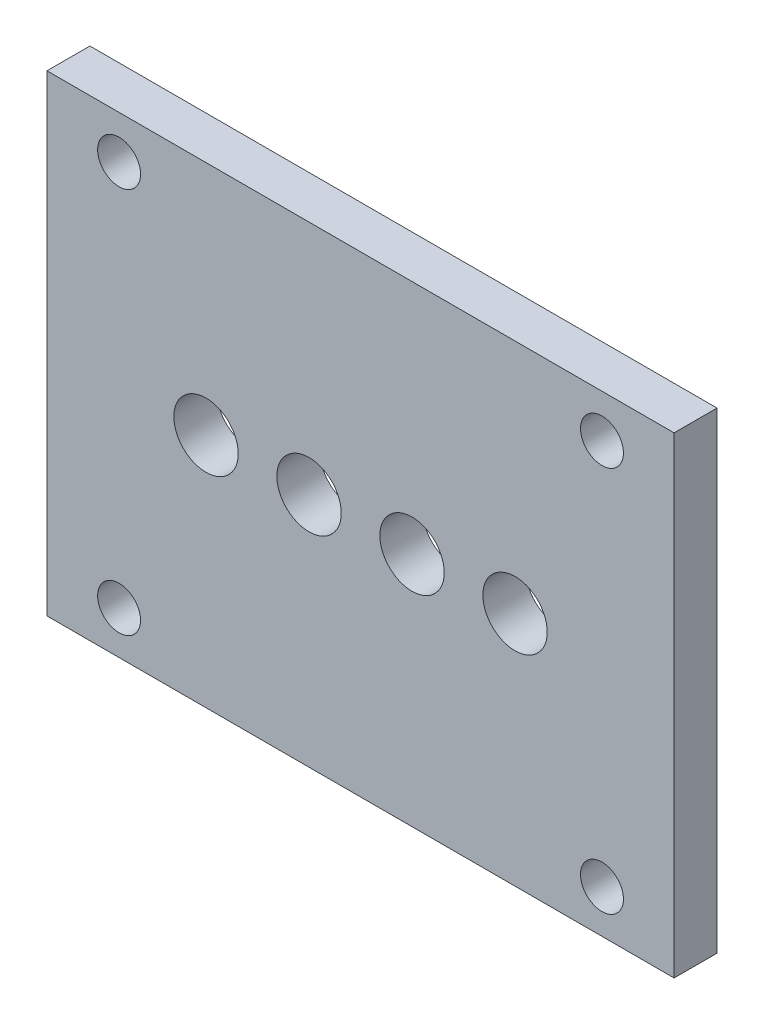
ISO-10303-21;
HEADER;
FILE_DESCRIPTION(('STEP AP214'),'2;1');
FILE_NAME('part.step','',(''),(''),'','','');
FILE_SCHEMA(('AUTOMOTIVE_DESIGN { 1 0 10303 214 1 1 1 1 }'));
ENDSEC;
DATA;
#1=APPLICATION_CONTEXT('core data for automotive mechanical design processes');
#2=APPLICATION_PROTOCOL_DEFINITION('international standard','automotive_design',2000,#1);
#3=PRODUCT_CONTEXT('',#1,'mechanical');
#4=PRODUCT('Part','Part','',(#3));
#5=PRODUCT_RELATED_PRODUCT_CATEGORY('part','',(#4));
#6=PRODUCT_DEFINITION_FORMATION('','',#4);
#7=PRODUCT_DEFINITION_CONTEXT('part definition',#1,'design');
#8=PRODUCT_DEFINITION('design','',#6,#7);
#9=PRODUCT_DEFINITION_SHAPE('','',#8);
#10=(LENGTH_UNIT() NAMED_UNIT(*) SI_UNIT(.MILLI.,.METRE.));
#11=(NAMED_UNIT(*) PLANE_ANGLE_UNIT() SI_UNIT($,.RADIAN.));
#12=(NAMED_UNIT(*) SI_UNIT($,.STERADIAN.) SOLID_ANGLE_UNIT());
#13=UNCERTAINTY_MEASURE_WITH_UNIT(LENGTH_MEASURE(1.E-05),#10,'distance_accuracy_value','');
#14=(GEOMETRIC_REPRESENTATION_CONTEXT(3) GLOBAL_UNCERTAINTY_ASSIGNED_CONTEXT((#13)) GLOBAL_UNIT_ASSIGNED_CONTEXT((#10,
#11,#12)) REPRESENTATION_CONTEXT('',''));
#15=CARTESIAN_POINT('',(0.,0.,0.));
#16=DIRECTION('',(0.,0.,1.));
#17=DIRECTION('',(1.,0.,0.));
#18=AXIS2_PLACEMENT_3D('',#15,#16,#17);
#19=CARTESIAN_POINT('',(-92.7735,69.85,12.7));
#20=DIRECTION('',(1.,0.,0.));
#21=DIRECTION('',(0.,0.,-1.));
#22=AXIS2_PLACEMENT_3D('',#19,#20,#21);
#23=PLANE('',#22);
#24=DIRECTION('',(0.,-1.,0.));
#25=VECTOR('',#24,1.);
#26=CARTESIAN_POINT('',(-92.7735,69.85,0.));
#27=LINE('',#26,#25);
#28=CARTESIAN_POINT('',(-92.7735,69.85,0.));
#29=VERTEX_POINT('',#28);
#30=CARTESIAN_POINT('',(-92.7735,-69.85,0.));
#31=VERTEX_POINT('',#30);
#32=EDGE_CURVE('E96',#29,#31,#27,.T.);
#33=ORIENTED_EDGE('',*,*,#32,.T.);
#34=DIRECTION('',(0.,0.,-1.));
#35=VECTOR('',#34,1.);
#36=CARTESIAN_POINT('',(-92.7735,-69.85,12.7));
#37=LINE('',#36,#35);
#38=CARTESIAN_POINT('',(-92.7735,-69.85,12.7));
#39=VERTEX_POINT('',#38);
#40=EDGE_CURVE('E11',#39,#31,#37,.T.);
#41=ORIENTED_EDGE('',*,*,#40,.F.);
#42=DIRECTION('',(0.,-1.,0.));
#43=VECTOR('',#42,1.);
#44=CARTESIAN_POINT('',(-92.7735,69.85,12.7));
#45=LINE('',#44,#43);
#46=CARTESIAN_POINT('',(-92.7735,69.85,12.7));
#47=VERTEX_POINT('',#46);
#48=EDGE_CURVE('E84',#47,#39,#45,.T.);
#49=ORIENTED_EDGE('',*,*,#48,.F.);
#50=DIRECTION('',(0.,0.,-1.));
#51=VECTOR('',#50,1.);
#52=CARTESIAN_POINT('',(-92.7735,69.85,12.7));
#53=LINE('',#52,#51);
#54=EDGE_CURVE('E92',#47,#29,#53,.T.);
#55=ORIENTED_EDGE('',*,*,#54,.T.);
#56=EDGE_LOOP('',(#33,#41,#49,#55));
#57=FACE_BOUND('',#56,.T.);
#58=ADVANCED_FACE('F33',(#57),#23,.F.);
#59=CARTESIAN_POINT('',(-92.7735,-69.85,12.7));
#60=DIRECTION('',(0.,1.,0.));
#61=DIRECTION('',(0.,0.,1.));
#62=AXIS2_PLACEMENT_3D('',#59,#60,#61);
#63=PLANE('',#62);
#64=DIRECTION('',(1.,0.,0.));
#65=VECTOR('',#64,1.);
#66=CARTESIAN_POINT('',(-92.7735,-69.85,0.));
#67=LINE('',#66,#65);
#68=CARTESIAN_POINT('',(92.7735,-69.85,0.));
#69=VERTEX_POINT('',#68);
#70=EDGE_CURVE('E88',#31,#69,#67,.T.);
#71=ORIENTED_EDGE('',*,*,#70,.T.);
#72=DIRECTION('',(0.,0.,-1.));
#73=VECTOR('',#72,1.);
#74=CARTESIAN_POINT('',(92.7735,-69.85,12.7));
#75=LINE('',#74,#73);
#76=CARTESIAN_POINT('',(92.7735,-69.85,12.7));
#77=VERTEX_POINT('',#76);
#78=EDGE_CURVE('E41',#77,#69,#75,.T.);
#79=ORIENTED_EDGE('',*,*,#78,.F.);
#80=DIRECTION('',(1.,0.,0.));
#81=VECTOR('',#80,1.);
#82=CARTESIAN_POINT('',(-92.7735,-69.85,12.7));
#83=LINE('',#82,#81);
#84=EDGE_CURVE('E79',#39,#77,#83,.T.);
#85=ORIENTED_EDGE('',*,*,#84,.F.);
#86=ORIENTED_EDGE('',*,*,#40,.T.);
#87=EDGE_LOOP('',(#71,#79,#85,#86));
#88=FACE_BOUND('',#87,.T.);
#89=ADVANCED_FACE('F87',(#88),#63,.F.);
#90=CARTESIAN_POINT('',(92.7735,69.85,12.7));
#91=DIRECTION('',(-1.,0.,0.));
#92=DIRECTION('',(0.,0.,1.));
#93=AXIS2_PLACEMENT_3D('',#90,#91,#92);
#94=PLANE('',#93);
#95=DIRECTION('',(0.,1.,0.));
#96=VECTOR('',#95,1.);
#97=CARTESIAN_POINT('',(92.7735,69.85,0.));
#98=LINE('',#97,#96);
#99=CARTESIAN_POINT('',(92.7735,69.85,0.));
#100=VERTEX_POINT('',#99);
#101=EDGE_CURVE('E66',#69,#100,#98,.T.);
#102=ORIENTED_EDGE('',*,*,#101,.T.);
#103=DIRECTION('',(0.,0.,-1.));
#104=VECTOR('',#103,1.);
#105=CARTESIAN_POINT('',(92.7735,69.85,12.7));
#106=LINE('',#105,#104);
#107=CARTESIAN_POINT('',(92.7735,69.85,12.7));
#108=VERTEX_POINT('',#107);
#109=EDGE_CURVE('E89',#108,#100,#106,.T.);
#110=ORIENTED_EDGE('',*,*,#109,.F.);
#111=DIRECTION('',(0.,1.,0.));
#112=VECTOR('',#111,1.);
#113=CARTESIAN_POINT('',(92.7735,69.85,12.7));
#114=LINE('',#113,#112);
#115=EDGE_CURVE('E82',#77,#108,#114,.T.);
#116=ORIENTED_EDGE('',*,*,#115,.F.);
#117=ORIENTED_EDGE('',*,*,#78,.T.);
#118=EDGE_LOOP('',(#102,#110,#116,#117));
#119=FACE_BOUND('',#118,.T.);
#120=ADVANCED_FACE('F90',(#119),#94,.F.);
#121=CARTESIAN_POINT('',(-92.7735,69.85,12.7));
#122=DIRECTION('',(0.,-1.,0.));
#123=DIRECTION('',(0.,0.,-1.));
#124=AXIS2_PLACEMENT_3D('',#121,#122,#123);
#125=PLANE('',#124);
#126=DIRECTION('',(-1.,0.,0.));
#127=VECTOR('',#126,1.);
#128=CARTESIAN_POINT('',(-92.7735,69.85,0.));
#129=LINE('',#128,#127);
#130=EDGE_CURVE('E72',#100,#29,#129,.T.);
#131=ORIENTED_EDGE('',*,*,#130,.T.);
#132=ORIENTED_EDGE('',*,*,#54,.F.);
#133=DIRECTION('',(-1.,0.,0.));
#134=VECTOR('',#133,1.);
#135=CARTESIAN_POINT('',(-92.7735,69.85,12.7));
#136=LINE('',#135,#134);
#137=EDGE_CURVE('E49',#108,#47,#136,.T.);
#138=ORIENTED_EDGE('',*,*,#137,.F.);
#139=ORIENTED_EDGE('',*,*,#109,.T.);
#140=EDGE_LOOP('',(#131,#132,#138,#139));
#141=FACE_BOUND('',#140,.T.);
#142=ADVANCED_FACE('F104',(#141),#125,.F.);
#143=CARTESIAN_POINT('',(0.,0.,12.7));
#144=DIRECTION('',(0.,0.,1.));
#145=DIRECTION('',(1.,0.,0.));
#146=AXIS2_PLACEMENT_3D('',#143,#144,#145);
#147=PLANE('',#146);
#148=CARTESIAN_POINT('',(71.4375,-57.15,12.7));
#149=DIRECTION('',(0.,0.,1.));
#150=DIRECTION('',(1.,0.,0.));
#151=AXIS2_PLACEMENT_3D('',#148,#149,#150);
#152=CIRCLE('',#151,6.35);
#153=CARTESIAN_POINT('',(77.7875,-57.15,12.7));
#154=VERTEX_POINT('',#153);
#155=EDGE_CURVE('E152',#154,#154,#152,.T.);
#156=ORIENTED_EDGE('',*,*,#155,.F.);
#157=EDGE_LOOP('',(#156));
#158=FACE_BOUND('',#157,.T.);
#159=CARTESIAN_POINT('',(71.4375,57.15,12.7));
#160=DIRECTION('',(0.,0.,1.));
#161=DIRECTION('',(1.,0.,0.));
#162=AXIS2_PLACEMENT_3D('',#159,#160,#161);
#163=CIRCLE('',#162,6.35);
#164=CARTESIAN_POINT('',(77.7875,57.15,12.7));
#165=VERTEX_POINT('',#164);
#166=EDGE_CURVE('E146',#165,#165,#163,.T.);
#167=ORIENTED_EDGE('',*,*,#166,.F.);
#168=EDGE_LOOP('',(#167));
#169=FACE_BOUND('',#168,.T.);
#170=CARTESIAN_POINT('',(-71.4375,-57.15,12.7));
#171=DIRECTION('',(0.,0.,1.));
#172=DIRECTION('',(1.,0.,0.));
#173=AXIS2_PLACEMENT_3D('',#170,#171,#172);
#174=CIRCLE('',#173,6.35);
#175=CARTESIAN_POINT('',(-65.0875,-57.15,12.7));
#176=VERTEX_POINT('',#175);
#177=EDGE_CURVE('E140',#176,#176,#174,.T.);
#178=ORIENTED_EDGE('',*,*,#177,.F.);
#179=EDGE_LOOP('',(#178));
#180=FACE_BOUND('',#179,.T.);
#181=CARTESIAN_POINT('',(-71.4375,57.15,12.7));
#182=DIRECTION('',(0.,0.,1.));
#183=DIRECTION('',(1.,0.,0.));
#184=AXIS2_PLACEMENT_3D('',#181,#182,#183);
#185=CIRCLE('',#184,6.35);
#186=CARTESIAN_POINT('',(-65.0875,57.15,12.7));
#187=VERTEX_POINT('',#186);
#188=EDGE_CURVE('E134',#187,#187,#185,.T.);
#189=ORIENTED_EDGE('',*,*,#188,.F.);
#190=EDGE_LOOP('',(#189));
#191=FACE_BOUND('',#190,.T.);
#192=CARTESIAN_POINT('',(45.72,0.,12.7));
#193=DIRECTION('',(0.,0.,1.));
#194=DIRECTION('',(1.,0.,0.));
#195=AXIS2_PLACEMENT_3D('',#192,#193,#194);
#196=CIRCLE('',#195,9.525);
#197=CARTESIAN_POINT('',(55.245,0.,12.7));
#198=VERTEX_POINT('',#197);
#199=EDGE_CURVE('E128',#198,#198,#196,.T.);
#200=ORIENTED_EDGE('',*,*,#199,.F.);
#201=EDGE_LOOP('',(#200));
#202=FACE_BOUND('',#201,.T.);
#203=CARTESIAN_POINT('',(15.24,0.,12.7));
#204=DIRECTION('',(0.,0.,1.));
#205=DIRECTION('',(1.,0.,0.));
#206=AXIS2_PLACEMENT_3D('',#203,#204,#205);
#207=CIRCLE('',#206,9.525);
#208=CARTESIAN_POINT('',(24.765,0.,12.7));
#209=VERTEX_POINT('',#208);
#210=EDGE_CURVE('E122',#209,#209,#207,.T.);
#211=ORIENTED_EDGE('',*,*,#210,.F.);
#212=EDGE_LOOP('',(#211));
#213=FACE_BOUND('',#212,.T.);
#214=CARTESIAN_POINT('',(-15.24,0.,12.7));
#215=DIRECTION('',(0.,0.,1.));
#216=DIRECTION('',(1.,0.,0.));
#217=AXIS2_PLACEMENT_3D('',#214,#215,#216);
#218=CIRCLE('',#217,9.525);
#219=CARTESIAN_POINT('',(-5.715,0.,12.7));
#220=VERTEX_POINT('',#219);
#221=EDGE_CURVE('E116',#220,#220,#218,.T.);
#222=ORIENTED_EDGE('',*,*,#221,.F.);
#223=EDGE_LOOP('',(#222));
#224=FACE_BOUND('',#223,.T.);
#225=CARTESIAN_POINT('',(-45.72,0.,12.7));
#226=DIRECTION('',(0.,0.,1.));
#227=DIRECTION('',(1.,0.,0.));
#228=AXIS2_PLACEMENT_3D('',#225,#226,#227);
#229=CIRCLE('',#228,9.525);
#230=CARTESIAN_POINT('',(-36.195,0.,12.7));
#231=VERTEX_POINT('',#230);
#232=EDGE_CURVE('E110',#231,#231,#229,.T.);
#233=ORIENTED_EDGE('',*,*,#232,.F.);
#234=EDGE_LOOP('',(#233));
#235=FACE_BOUND('',#234,.T.);
#236=ORIENTED_EDGE('',*,*,#48,.T.);
#237=ORIENTED_EDGE('',*,*,#84,.T.);
#238=ORIENTED_EDGE('',*,*,#115,.T.);
#239=ORIENTED_EDGE('',*,*,#137,.T.);
#240=EDGE_LOOP('',(#236,#237,#238,#239));
#241=FACE_BOUND('',#240,.T.);
#242=ADVANCED_FACE('F80',(#158,#169,#180,#191,#202,#213,#224,#235,#241),#147,.T.);
#243=CARTESIAN_POINT('',(0.,0.,0.));
#244=DIRECTION('',(0.,0.,1.));
#245=DIRECTION('',(1.,0.,0.));
#246=AXIS2_PLACEMENT_3D('',#243,#244,#245);
#247=PLANE('',#246);
#248=CARTESIAN_POINT('',(71.4375,-57.15,0.));
#249=DIRECTION('',(0.,0.,1.));
#250=DIRECTION('',(1.,0.,0.));
#251=AXIS2_PLACEMENT_3D('',#248,#249,#250);
#252=CIRCLE('',#251,6.35);
#253=CARTESIAN_POINT('',(77.7875,-57.15,0.));
#254=VERTEX_POINT('',#253);
#255=EDGE_CURVE('E149',#254,#254,#252,.T.);
#256=ORIENTED_EDGE('',*,*,#255,.T.);
#257=EDGE_LOOP('',(#256));
#258=FACE_BOUND('',#257,.T.);
#259=CARTESIAN_POINT('',(71.4375,57.15,0.));
#260=DIRECTION('',(0.,0.,1.));
#261=DIRECTION('',(1.,0.,0.));
#262=AXIS2_PLACEMENT_3D('',#259,#260,#261);
#263=CIRCLE('',#262,6.35);
#264=CARTESIAN_POINT('',(77.7875,57.15,0.));
#265=VERTEX_POINT('',#264);
#266=EDGE_CURVE('E143',#265,#265,#263,.T.);
#267=ORIENTED_EDGE('',*,*,#266,.T.);
#268=EDGE_LOOP('',(#267));
#269=FACE_BOUND('',#268,.T.);
#270=CARTESIAN_POINT('',(-71.4375,-57.15,0.));
#271=DIRECTION('',(0.,0.,1.));
#272=DIRECTION('',(1.,0.,0.));
#273=AXIS2_PLACEMENT_3D('',#270,#271,#272);
#274=CIRCLE('',#273,6.35);
#275=CARTESIAN_POINT('',(-65.0875,-57.15,0.));
#276=VERTEX_POINT('',#275);
#277=EDGE_CURVE('E137',#276,#276,#274,.T.);
#278=ORIENTED_EDGE('',*,*,#277,.T.);
#279=EDGE_LOOP('',(#278));
#280=FACE_BOUND('',#279,.T.);
#281=CARTESIAN_POINT('',(-71.4375,57.15,0.));
#282=DIRECTION('',(0.,0.,1.));
#283=DIRECTION('',(1.,0.,0.));
#284=AXIS2_PLACEMENT_3D('',#281,#282,#283);
#285=CIRCLE('',#284,6.35);
#286=CARTESIAN_POINT('',(-65.0875,57.15,0.));
#287=VERTEX_POINT('',#286);
#288=EDGE_CURVE('E131',#287,#287,#285,.T.);
#289=ORIENTED_EDGE('',*,*,#288,.T.);
#290=EDGE_LOOP('',(#289));
#291=FACE_BOUND('',#290,.T.);
#292=CARTESIAN_POINT('',(45.72,0.,0.));
#293=DIRECTION('',(0.,0.,1.));
#294=DIRECTION('',(1.,0.,0.));
#295=AXIS2_PLACEMENT_3D('',#292,#293,#294);
#296=CIRCLE('',#295,9.525);
#297=CARTESIAN_POINT('',(55.245,0.,0.));
#298=VERTEX_POINT('',#297);
#299=EDGE_CURVE('E125',#298,#298,#296,.T.);
#300=ORIENTED_EDGE('',*,*,#299,.T.);
#301=EDGE_LOOP('',(#300));
#302=FACE_BOUND('',#301,.T.);
#303=CARTESIAN_POINT('',(15.24,0.,0.));
#304=DIRECTION('',(0.,0.,1.));
#305=DIRECTION('',(1.,0.,0.));
#306=AXIS2_PLACEMENT_3D('',#303,#304,#305);
#307=CIRCLE('',#306,9.525);
#308=CARTESIAN_POINT('',(24.765,0.,0.));
#309=VERTEX_POINT('',#308);
#310=EDGE_CURVE('E119',#309,#309,#307,.T.);
#311=ORIENTED_EDGE('',*,*,#310,.T.);
#312=EDGE_LOOP('',(#311));
#313=FACE_BOUND('',#312,.T.);
#314=CARTESIAN_POINT('',(-15.24,0.,0.));
#315=DIRECTION('',(0.,0.,1.));
#316=DIRECTION('',(1.,0.,0.));
#317=AXIS2_PLACEMENT_3D('',#314,#315,#316);
#318=CIRCLE('',#317,9.525);
#319=CARTESIAN_POINT('',(-5.715,0.,0.));
#320=VERTEX_POINT('',#319);
#321=EDGE_CURVE('E113',#320,#320,#318,.T.);
#322=ORIENTED_EDGE('',*,*,#321,.T.);
#323=EDGE_LOOP('',(#322));
#324=FACE_BOUND('',#323,.T.);
#325=CARTESIAN_POINT('',(-45.72,0.,0.));
#326=DIRECTION('',(0.,0.,1.));
#327=DIRECTION('',(1.,0.,0.));
#328=AXIS2_PLACEMENT_3D('',#325,#326,#327);
#329=CIRCLE('',#328,9.525);
#330=CARTESIAN_POINT('',(-36.195,0.,0.));
#331=VERTEX_POINT('',#330);
#332=EDGE_CURVE('E99',#331,#331,#329,.T.);
#333=ORIENTED_EDGE('',*,*,#332,.T.);
#334=EDGE_LOOP('',(#333));
#335=FACE_BOUND('',#334,.T.);
#336=ORIENTED_EDGE('',*,*,#32,.F.);
#337=ORIENTED_EDGE('',*,*,#130,.F.);
#338=ORIENTED_EDGE('',*,*,#101,.F.);
#339=ORIENTED_EDGE('',*,*,#70,.F.);
#340=EDGE_LOOP('',(#336,#337,#338,#339));
#341=FACE_BOUND('',#340,.T.);
#342=ADVANCED_FACE('F107',(#258,#269,#280,#291,#302,#313,#324,#335,#341),#247,.F.);
#343=CARTESIAN_POINT('',(-45.72,0.,0.));
#344=DIRECTION('',(0.,0.,1.));
#345=DIRECTION('',(1.,0.,0.));
#346=AXIS2_PLACEMENT_3D('',#343,#344,#345);
#347=CYLINDRICAL_SURFACE('',#346,9.525);
#348=ORIENTED_EDGE('',*,*,#332,.F.);
#349=EDGE_LOOP('',(#348));
#350=FACE_BOUND('',#349,.T.);
#351=ORIENTED_EDGE('',*,*,#232,.T.);
#352=EDGE_LOOP('',(#351));
#353=FACE_BOUND('',#352,.T.);
#354=ADVANCED_FACE('F184',(#350,#353),#347,.F.);
#355=CARTESIAN_POINT('',(-15.24,0.,0.));
#356=DIRECTION('',(0.,0.,1.));
#357=DIRECTION('',(1.,0.,0.));
#358=AXIS2_PLACEMENT_3D('',#355,#356,#357);
#359=CYLINDRICAL_SURFACE('',#358,9.525);
#360=ORIENTED_EDGE('',*,*,#321,.F.);
#361=EDGE_LOOP('',(#360));
#362=FACE_BOUND('',#361,.T.);
#363=ORIENTED_EDGE('',*,*,#221,.T.);
#364=EDGE_LOOP('',(#363));
#365=FACE_BOUND('',#364,.T.);
#366=ADVANCED_FACE('F186',(#362,#365),#359,.F.);
#367=CARTESIAN_POINT('',(15.24,0.,0.));
#368=DIRECTION('',(0.,0.,1.));
#369=DIRECTION('',(1.,0.,0.));
#370=AXIS2_PLACEMENT_3D('',#367,#368,#369);
#371=CYLINDRICAL_SURFACE('',#370,9.525);
#372=ORIENTED_EDGE('',*,*,#310,.F.);
#373=EDGE_LOOP('',(#372));
#374=FACE_BOUND('',#373,.T.);
#375=ORIENTED_EDGE('',*,*,#210,.T.);
#376=EDGE_LOOP('',(#375));
#377=FACE_BOUND('',#376,.T.);
#378=ADVANCED_FACE('F193',(#374,#377),#371,.F.);
#379=CARTESIAN_POINT('',(45.72,0.,0.));
#380=DIRECTION('',(0.,0.,1.));
#381=DIRECTION('',(1.,0.,0.));
#382=AXIS2_PLACEMENT_3D('',#379,#380,#381);
#383=CYLINDRICAL_SURFACE('',#382,9.525);
#384=ORIENTED_EDGE('',*,*,#299,.F.);
#385=EDGE_LOOP('',(#384));
#386=FACE_BOUND('',#385,.T.);
#387=ORIENTED_EDGE('',*,*,#199,.T.);
#388=EDGE_LOOP('',(#387));
#389=FACE_BOUND('',#388,.T.);
#390=ADVANCED_FACE('F233',(#386,#389),#383,.F.);
#391=CARTESIAN_POINT('',(-71.4375,57.15,0.));
#392=DIRECTION('',(0.,0.,1.));
#393=DIRECTION('',(1.,0.,0.));
#394=AXIS2_PLACEMENT_3D('',#391,#392,#393);
#395=CYLINDRICAL_SURFACE('',#394,6.35);
#396=ORIENTED_EDGE('',*,*,#288,.F.);
#397=EDGE_LOOP('',(#396));
#398=FACE_BOUND('',#397,.T.);
#399=ORIENTED_EDGE('',*,*,#188,.T.);
#400=EDGE_LOOP('',(#399));
#401=FACE_BOUND('',#400,.T.);
#402=ADVANCED_FACE('F227',(#398,#401),#395,.F.);
#403=CARTESIAN_POINT('',(-71.4375,-57.15,0.));
#404=DIRECTION('',(0.,0.,1.));
#405=DIRECTION('',(1.,0.,0.));
#406=AXIS2_PLACEMENT_3D('',#403,#404,#405);
#407=CYLINDRICAL_SURFACE('',#406,6.35);
#408=ORIENTED_EDGE('',*,*,#277,.F.);
#409=EDGE_LOOP('',(#408));
#410=FACE_BOUND('',#409,.T.);
#411=ORIENTED_EDGE('',*,*,#177,.T.);
#412=EDGE_LOOP('',(#411));
#413=FACE_BOUND('',#412,.T.);
#414=ADVANCED_FACE('F232',(#410,#413),#407,.F.);
#415=CARTESIAN_POINT('',(71.4375,57.15,0.));
#416=DIRECTION('',(0.,0.,1.));
#417=DIRECTION('',(1.,0.,0.));
#418=AXIS2_PLACEMENT_3D('',#415,#416,#417);
#419=CYLINDRICAL_SURFACE('',#418,6.35);
#420=ORIENTED_EDGE('',*,*,#266,.F.);
#421=EDGE_LOOP('',(#420));
#422=FACE_BOUND('',#421,.T.);
#423=ORIENTED_EDGE('',*,*,#166,.T.);
#424=EDGE_LOOP('',(#423));
#425=FACE_BOUND('',#424,.T.);
#426=ADVANCED_FACE('F163',(#422,#425),#419,.F.);
#427=CARTESIAN_POINT('',(71.4375,-57.15,0.));
#428=DIRECTION('',(0.,0.,1.));
#429=DIRECTION('',(1.,0.,0.));
#430=AXIS2_PLACEMENT_3D('',#427,#428,#429);
#431=CYLINDRICAL_SURFACE('',#430,6.35);
#432=ORIENTED_EDGE('',*,*,#255,.F.);
#433=EDGE_LOOP('',(#432));
#434=FACE_BOUND('',#433,.T.);
#435=ORIENTED_EDGE('',*,*,#155,.T.);
#436=EDGE_LOOP('',(#435));
#437=FACE_BOUND('',#436,.T.);
#438=ADVANCED_FACE('F160',(#434,#437),#431,.F.);
#439=CLOSED_SHELL('',(#58,#89,#120,#142,#242,#342,#354,#366,#378,#390,#402,#414,#426,#438));
#440=MANIFOLD_SOLID_BREP('B2',#439);
#441=ADVANCED_BREP_SHAPE_REPRESENTATION('',(#18,#440),#14);
#442=SHAPE_DEFINITION_REPRESENTATION(#9,#441);
ENDSEC;
END-ISO-10303-21;
